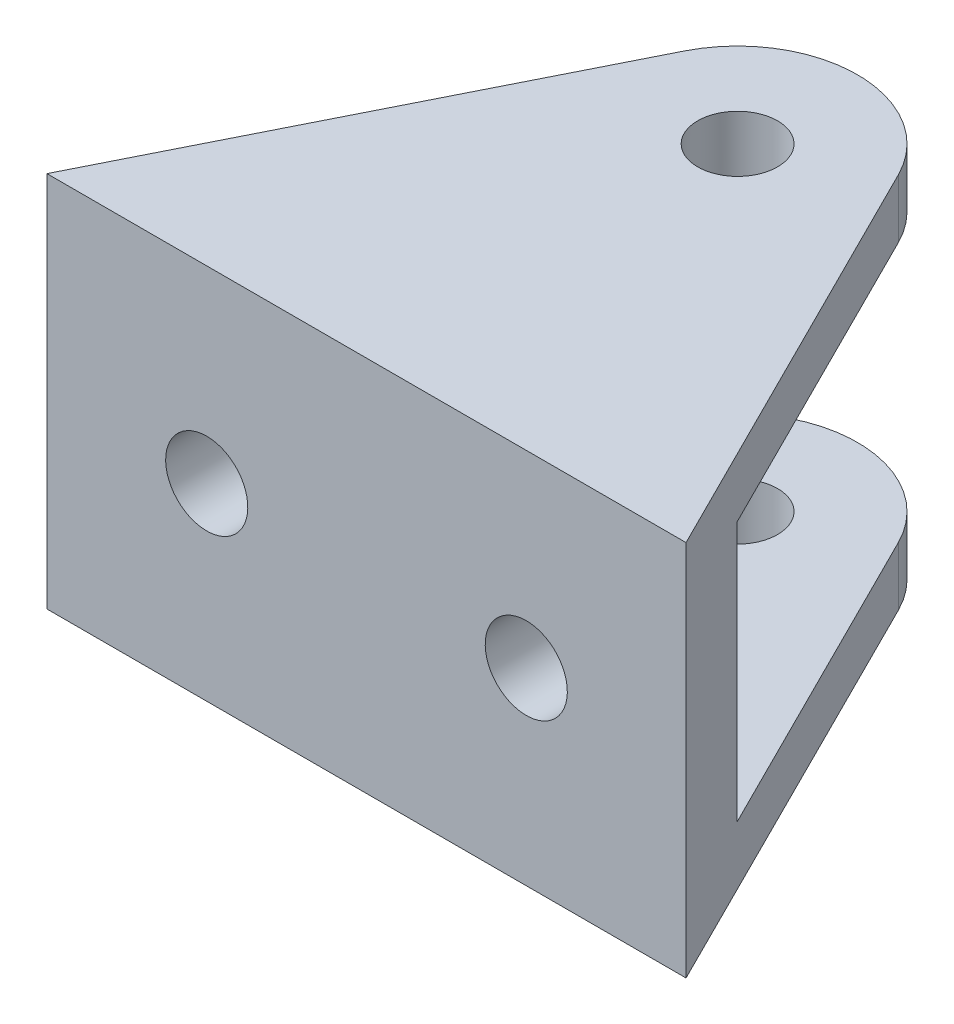
ISO-10303-21;
HEADER;
FILE_DESCRIPTION(('STEP AP214'),'2;1');
FILE_NAME('part.step','',(''),(''),'','','');
FILE_SCHEMA(('AUTOMOTIVE_DESIGN { 1 0 10303 214 1 1 1 1 }'));
ENDSEC;
DATA;
#1=APPLICATION_CONTEXT('core data for automotive mechanical design processes');
#2=APPLICATION_PROTOCOL_DEFINITION('international standard','automotive_design',2000,#1);
#3=PRODUCT_CONTEXT('',#1,'mechanical');
#4=PRODUCT('Part','Part','',(#3));
#5=PRODUCT_RELATED_PRODUCT_CATEGORY('part','',(#4));
#6=PRODUCT_DEFINITION_FORMATION('','',#4);
#7=PRODUCT_DEFINITION_CONTEXT('part definition',#1,'design');
#8=PRODUCT_DEFINITION('design','',#6,#7);
#9=PRODUCT_DEFINITION_SHAPE('','',#8);
#10=(LENGTH_UNIT() NAMED_UNIT(*) SI_UNIT(.MILLI.,.METRE.));
#11=(NAMED_UNIT(*) PLANE_ANGLE_UNIT() SI_UNIT($,.RADIAN.));
#12=(NAMED_UNIT(*) SI_UNIT($,.STERADIAN.) SOLID_ANGLE_UNIT());
#13=UNCERTAINTY_MEASURE_WITH_UNIT(LENGTH_MEASURE(1.E-05),#10,'distance_accuracy_value','');
#14=(GEOMETRIC_REPRESENTATION_CONTEXT(3) GLOBAL_UNCERTAINTY_ASSIGNED_CONTEXT((#13)) GLOBAL_UNIT_ASSIGNED_CONTEXT((#10,
#11,#12)) REPRESENTATION_CONTEXT('',''));
#15=CARTESIAN_POINT('',(0.,0.,0.));
#16=DIRECTION('',(0.,0.,1.));
#17=DIRECTION('',(1.,0.,0.));
#18=AXIS2_PLACEMENT_3D('',#15,#16,#17);
#19=CARTESIAN_POINT('',(50.8,0.,-39.8563150306832));
#20=DIRECTION('',(0.,1.,0.));
#21=DIRECTION('',(0.,0.,1.));
#22=AXIS2_PLACEMENT_3D('',#19,#20,#21);
#23=PLANE('',#22);
#24=CARTESIAN_POINT('',(25.4,0.,-29.4977893685772));
#25=DIRECTION('',(0.,-1.,0.));
#26=DIRECTION('',(0.,0.,-1.));
#27=AXIS2_PLACEMENT_3D('',#24,#25,#26);
#28=CIRCLE('',#27,3.175);
#29=CARTESIAN_POINT('',(25.4,0.,-32.6727893685772));
#30=VERTEX_POINT('',#29);
#31=EDGE_CURVE('E216',#30,#30,#28,.T.);
#32=ORIENTED_EDGE('',*,*,#31,.F.);
#33=EDGE_LOOP('',(#32));
#34=FACE_BOUND('',#33,.T.);
#35=DIRECTION('',(-1.,0.,0.));
#36=VECTOR('',#35,1.);
#37=CARTESIAN_POINT('',(50.8,0.,0.));
#38=LINE('',#37,#36);
#39=CARTESIAN_POINT('',(50.8,0.,0.));
#40=VERTEX_POINT('',#39);
#41=CARTESIAN_POINT('',(0.,0.,0.));
#42=VERTEX_POINT('',#41);
#43=EDGE_CURVE('E135',#40,#42,#38,.T.);
#44=ORIENTED_EDGE('',*,*,#43,.T.);
#45=DIRECTION('',(-0.44725241700816,0.,0.894407779192668));
#46=VECTOR('',#45,1.);
#47=CARTESIAN_POINT('',(0.,0.,0.));
#48=LINE('',#47,#46);
#49=CARTESIAN_POINT('',(16.8807659031898,0.,-33.7578686405799));
#50=VERTEX_POINT('',#49);
#51=EDGE_CURVE('E70',#50,#42,#48,.T.);
#52=ORIENTED_EDGE('',*,*,#51,.F.);
#53=CARTESIAN_POINT('',(25.4,0.,-29.4977893685772));
#54=DIRECTION('',(0.,1.,0.));
#55=DIRECTION('',(0.,0.,-1.));
#56=AXIS2_PLACEMENT_3D('',#53,#54,#55);
#57=CIRCLE('',#56,9.525);
#58=CARTESIAN_POINT('',(33.9192340968102,0.,-33.7578686405799));
#59=VERTEX_POINT('',#58);
#60=EDGE_CURVE('E230',#59,#50,#57,.T.);
#61=ORIENTED_EDGE('',*,*,#60,.F.);
#62=DIRECTION('',(-0.447252417008159,0.,-0.894407779192668));
#63=VECTOR('',#62,1.);
#64=CARTESIAN_POINT('',(50.8,0.,0.));
#65=LINE('',#64,#63);
#66=EDGE_CURVE('E220',#40,#59,#65,.T.);
#67=ORIENTED_EDGE('',*,*,#66,.F.);
#68=EDGE_LOOP('',(#44,#52,#61,#67));
#69=FACE_BOUND('',#68,.T.);
#70=ADVANCED_FACE('F47',(#34,#69),#23,.F.);
#71=CARTESIAN_POINT('',(50.8,4.6609,-8.10631503068315));
#72=DIRECTION('',(0.,-1.,0.));
#73=DIRECTION('',(0.,0.,-1.));
#74=AXIS2_PLACEMENT_3D('',#71,#72,#73);
#75=PLANE('',#74);
#76=CARTESIAN_POINT('',(25.4,4.6609,-29.4977893685772));
#77=DIRECTION('',(0.,-1.,0.));
#78=DIRECTION('',(0.,0.,-1.));
#79=AXIS2_PLACEMENT_3D('',#76,#77,#78);
#80=CIRCLE('',#79,3.175);
#81=CARTESIAN_POINT('',(25.4,4.6609,-32.6727893685772));
#82=VERTEX_POINT('',#81);
#83=EDGE_CURVE('E183',#82,#82,#80,.T.);
#84=ORIENTED_EDGE('',*,*,#83,.T.);
#85=EDGE_LOOP('',(#84));
#86=FACE_BOUND('',#85,.T.);
#87=CARTESIAN_POINT('',(25.4,4.6609,-29.4977893685772));
#88=DIRECTION('',(0.,-1.,0.));
#89=DIRECTION('',(0.,0.,-1.));
#90=AXIS2_PLACEMENT_3D('',#87,#88,#89);
#91=CIRCLE('',#90,9.525);
#92=CARTESIAN_POINT('',(33.9192340968102,4.6609,-33.7578686405799));
#93=VERTEX_POINT('',#92);
#94=CARTESIAN_POINT('',(16.8807659031898,4.6609,-33.7578686405799));
#95=VERTEX_POINT('',#94);
#96=EDGE_CURVE('E175',#93,#95,#91,.F.);
#97=ORIENTED_EDGE('',*,*,#96,.T.);
#98=DIRECTION('',(-0.44725241700816,0.,0.894407779192667));
#99=VECTOR('',#98,1.);
#100=CARTESIAN_POINT('',(13.404501114703,4.6609,-26.8060934212199));
#101=LINE('',#100,#99);
#102=CARTESIAN_POINT('',(4.05359733540691,4.66090000000001,-8.10631503068315));
#103=VERTEX_POINT('',#102);
#104=EDGE_CURVE('E200',#95,#103,#101,.T.);
#105=ORIENTED_EDGE('',*,*,#104,.T.);
#106=DIRECTION('',(-1.,0.,0.));
#107=VECTOR('',#106,1.);
#108=CARTESIAN_POINT('',(50.8,4.6609,-8.10631503068315));
#109=LINE('',#108,#107);
#110=CARTESIAN_POINT('',(46.7464026645931,4.6609,-8.10631503068315));
#111=VERTEX_POINT('',#110);
#112=EDGE_CURVE('E11',#111,#103,#109,.T.);
#113=ORIENTED_EDGE('',*,*,#112,.F.);
#114=DIRECTION('',(-0.447252417008159,0.,-0.894407779192668));
#115=VECTOR('',#114,1.);
#116=CARTESIAN_POINT('',(47.5572628908948,4.6609,-6.48477053665103));
#117=LINE('',#116,#115);
#118=EDGE_CURVE('E191',#111,#93,#117,.T.);
#119=ORIENTED_EDGE('',*,*,#118,.T.);
#120=EDGE_LOOP('',(#97,#105,#113,#119));
#121=FACE_BOUND('',#120,.T.);
#122=ADVANCED_FACE('F255',(#86,#121),#75,.F.);
#123=CARTESIAN_POINT('',(50.8,25.3111,-8.10631503068315));
#124=DIRECTION('',(0.,0.,1.));
#125=DIRECTION('',(0.,-1.,0.));
#126=AXIS2_PLACEMENT_3D('',#123,#124,#125);
#127=PLANE('',#126);
#128=CARTESIAN_POINT('',(38.1,14.986,-8.10631503068315));
#129=DIRECTION('',(0.,0.,-1.));
#130=DIRECTION('',(0.,1.,0.));
#131=AXIS2_PLACEMENT_3D('',#128,#129,#130);
#132=CIRCLE('',#131,7.14374999999999);
#133=CARTESIAN_POINT('',(38.1,22.12975,-8.10631503068315));
#134=VERTEX_POINT('',#133);
#135=EDGE_CURVE('E171',#134,#134,#132,.T.);
#136=ORIENTED_EDGE('',*,*,#135,.F.);
#137=EDGE_LOOP('',(#136));
#138=FACE_BOUND('',#137,.T.);
#139=CARTESIAN_POINT('',(12.7,14.986,-8.10631503068315));
#140=DIRECTION('',(0.,0.,-1.));
#141=DIRECTION('',(0.,1.,0.));
#142=AXIS2_PLACEMENT_3D('',#139,#140,#141);
#143=CIRCLE('',#142,7.14374999999999);
#144=CARTESIAN_POINT('',(12.7,22.12975,-8.10631503068315));
#145=VERTEX_POINT('',#144);
#146=EDGE_CURVE('E155',#145,#145,#143,.T.);
#147=ORIENTED_EDGE('',*,*,#146,.F.);
#148=EDGE_LOOP('',(#147));
#149=FACE_BOUND('',#148,.T.);
#150=ORIENTED_EDGE('',*,*,#112,.T.);
#151=DIRECTION('',(0.,1.,0.));
#152=VECTOR('',#151,1.);
#153=CARTESIAN_POINT('',(4.05359733540691,25.3111,-8.10631503068315));
#154=LINE('',#153,#152);
#155=CARTESIAN_POINT('',(4.05359733540691,25.3111,-8.10631503068315));
#156=VERTEX_POINT('',#155);
#157=EDGE_CURVE('E204',#103,#156,#154,.T.);
#158=ORIENTED_EDGE('',*,*,#157,.T.);
#159=DIRECTION('',(-1.,0.,0.));
#160=VECTOR('',#159,1.);
#161=CARTESIAN_POINT('',(50.8,25.3111,-8.10631503068315));
#162=LINE('',#161,#160);
#163=CARTESIAN_POINT('',(46.7464026645931,25.3111,-8.10631503068315));
#164=VERTEX_POINT('',#163);
#165=EDGE_CURVE('E55',#164,#156,#162,.T.);
#166=ORIENTED_EDGE('',*,*,#165,.F.);
#167=DIRECTION('',(0.,-1.,0.));
#168=VECTOR('',#167,1.);
#169=CARTESIAN_POINT('',(46.7464026645931,25.3111,-8.10631503068315));
#170=LINE('',#169,#168);
#171=EDGE_CURVE('E62',#164,#111,#170,.T.);
#172=ORIENTED_EDGE('',*,*,#171,.T.);
#173=EDGE_LOOP('',(#150,#158,#166,#172));
#174=FACE_BOUND('',#173,.T.);
#175=ADVANCED_FACE('F261',(#138,#149,#174),#127,.F.);
#176=CARTESIAN_POINT('',(50.8,25.3111,-39.8563150306832));
#177=DIRECTION('',(0.,1.,0.));
#178=DIRECTION('',(0.,0.,1.));
#179=AXIS2_PLACEMENT_3D('',#176,#177,#178);
#180=PLANE('',#179);
#181=CARTESIAN_POINT('',(25.4,25.3111,-29.4977893685772));
#182=DIRECTION('',(0.,1.,0.));
#183=DIRECTION('',(0.,0.,1.));
#184=AXIS2_PLACEMENT_3D('',#181,#182,#183);
#185=CIRCLE('',#184,3.175);
#186=CARTESIAN_POINT('',(25.4,25.3111,-26.3227893685772));
#187=VERTEX_POINT('',#186);
#188=EDGE_CURVE('E187',#187,#187,#185,.T.);
#189=ORIENTED_EDGE('',*,*,#188,.T.);
#190=EDGE_LOOP('',(#189));
#191=FACE_BOUND('',#190,.T.);
#192=ORIENTED_EDGE('',*,*,#165,.T.);
#193=DIRECTION('',(0.44725241700816,0.,-0.894407779192667));
#194=VECTOR('',#193,1.);
#195=CARTESIAN_POINT('',(26.1053279175585,25.3111,-52.2049909177213));
#196=LINE('',#195,#194);
#197=CARTESIAN_POINT('',(16.8807659031898,25.3111,-33.7578686405799));
#198=VERTEX_POINT('',#197);
#199=EDGE_CURVE('E208',#156,#198,#196,.T.);
#200=ORIENTED_EDGE('',*,*,#199,.T.);
#201=CARTESIAN_POINT('',(25.4,25.3111,-29.4977893685772));
#202=DIRECTION('',(0.,1.,0.));
#203=DIRECTION('',(0.,0.,1.));
#204=AXIS2_PLACEMENT_3D('',#201,#202,#203);
#205=CIRCLE('',#204,9.525);
#206=CARTESIAN_POINT('',(33.9192340968102,25.3111,-33.7578686405799));
#207=VERTEX_POINT('',#206);
#208=EDGE_CURVE('E179',#198,#207,#205,.F.);
#209=ORIENTED_EDGE('',*,*,#208,.T.);
#210=DIRECTION('',(0.447252417008159,0.,0.894407779192668));
#211=VECTOR('',#210,1.);
#212=CARTESIAN_POINT('',(34.8564360880392,25.3111,-31.8836680331524));
#213=LINE('',#212,#211);
#214=EDGE_CURVE('E197',#207,#164,#213,.T.);
#215=ORIENTED_EDGE('',*,*,#214,.T.);
#216=EDGE_LOOP('',(#192,#200,#209,#215));
#217=FACE_BOUND('',#216,.T.);
#218=ADVANCED_FACE('F276',(#191,#217),#180,.F.);
#219=CARTESIAN_POINT('',(50.8,29.972,0.));
#220=DIRECTION('',(0.,-1.,0.));
#221=DIRECTION('',(0.,0.,-1.));
#222=AXIS2_PLACEMENT_3D('',#219,#220,#221);
#223=PLANE('',#222);
#224=CARTESIAN_POINT('',(25.4,29.972,-29.4977893685772));
#225=DIRECTION('',(0.,-1.,0.));
#226=DIRECTION('',(0.,0.,-1.));
#227=AXIS2_PLACEMENT_3D('',#224,#225,#226);
#228=CIRCLE('',#227,3.175);
#229=CARTESIAN_POINT('',(25.4,29.972,-32.6727893685772));
#230=VERTEX_POINT('',#229);
#231=EDGE_CURVE('E212',#230,#230,#228,.F.);
#232=ORIENTED_EDGE('',*,*,#231,.F.);
#233=EDGE_LOOP('',(#232));
#234=FACE_BOUND('',#233,.T.);
#235=CARTESIAN_POINT('',(25.4,29.972,-29.4977893685772));
#236=DIRECTION('',(0.,-1.,0.));
#237=DIRECTION('',(0.,0.,-1.));
#238=AXIS2_PLACEMENT_3D('',#235,#236,#237);
#239=CIRCLE('',#238,9.525);
#240=CARTESIAN_POINT('',(16.8807659031898,29.972,-33.7578686405799));
#241=VERTEX_POINT('',#240);
#242=CARTESIAN_POINT('',(33.9192340968102,29.972,-33.7578686405799));
#243=VERTEX_POINT('',#242);
#244=EDGE_CURVE('E130',#241,#243,#239,.T.);
#245=ORIENTED_EDGE('',*,*,#244,.F.);
#246=DIRECTION('',(0.44725241700816,0.,-0.894407779192667));
#247=VECTOR('',#246,1.);
#248=CARTESIAN_POINT('',(0.,29.972,0.));
#249=LINE('',#248,#247);
#250=CARTESIAN_POINT('',(0.,29.972,0.));
#251=VERTEX_POINT('',#250);
#252=EDGE_CURVE('E113',#251,#241,#249,.T.);
#253=ORIENTED_EDGE('',*,*,#252,.F.);
#254=DIRECTION('',(-1.,0.,0.));
#255=VECTOR('',#254,1.);
#256=CARTESIAN_POINT('',(50.8,29.972,0.));
#257=LINE('',#256,#255);
#258=CARTESIAN_POINT('',(50.8,29.972,0.));
#259=VERTEX_POINT('',#258);
#260=EDGE_CURVE('E128',#259,#251,#257,.T.);
#261=ORIENTED_EDGE('',*,*,#260,.F.);
#262=DIRECTION('',(0.447252417008159,0.,0.894407779192668));
#263=VECTOR('',#262,1.);
#264=CARTESIAN_POINT('',(50.8,29.972,0.));
#265=LINE('',#264,#263);
#266=EDGE_CURVE('E221',#243,#259,#265,.T.);
#267=ORIENTED_EDGE('',*,*,#266,.F.);
#268=EDGE_LOOP('',(#245,#253,#261,#267));
#269=FACE_BOUND('',#268,.T.);
#270=ADVANCED_FACE('F126',(#234,#269),#223,.F.);
#271=CARTESIAN_POINT('',(50.8,0.,0.));
#272=DIRECTION('',(0.,0.,-1.));
#273=DIRECTION('',(-1.,0.,0.));
#274=AXIS2_PLACEMENT_3D('',#271,#272,#273);
#275=PLANE('',#274);
#276=CARTESIAN_POINT('',(38.1,14.986,0.));
#277=DIRECTION('',(0.,0.,-1.));
#278=DIRECTION('',(0.,1.,0.));
#279=AXIS2_PLACEMENT_3D('',#276,#277,#278);
#280=CIRCLE('',#279,3.2639);
#281=CARTESIAN_POINT('',(38.1,18.2499,0.));
#282=VERTEX_POINT('',#281);
#283=EDGE_CURVE('E159',#282,#282,#280,.T.);
#284=ORIENTED_EDGE('',*,*,#283,.T.);
#285=EDGE_LOOP('',(#284));
#286=FACE_BOUND('',#285,.T.);
#287=CARTESIAN_POINT('',(12.7,14.986,0.));
#288=DIRECTION('',(0.,0.,-1.));
#289=DIRECTION('',(0.,1.,0.));
#290=AXIS2_PLACEMENT_3D('',#287,#288,#289);
#291=CIRCLE('',#290,3.2639);
#292=CARTESIAN_POINT('',(12.7,18.2499,0.));
#293=VERTEX_POINT('',#292);
#294=EDGE_CURVE('E121',#293,#293,#291,.T.);
#295=ORIENTED_EDGE('',*,*,#294,.T.);
#296=EDGE_LOOP('',(#295));
#297=FACE_BOUND('',#296,.T.);
#298=DIRECTION('',(0.,-1.,0.));
#299=VECTOR('',#298,1.);
#300=CARTESIAN_POINT('',(0.,0.,0.));
#301=LINE('',#300,#299);
#302=EDGE_CURVE('E109',#251,#42,#301,.T.);
#303=ORIENTED_EDGE('',*,*,#302,.T.);
#304=ORIENTED_EDGE('',*,*,#43,.F.);
#305=DIRECTION('',(0.,-1.,0.));
#306=VECTOR('',#305,1.);
#307=CARTESIAN_POINT('',(50.8,0.,0.));
#308=LINE('',#307,#306);
#309=EDGE_CURVE('E120',#259,#40,#308,.T.);
#310=ORIENTED_EDGE('',*,*,#309,.F.);
#311=ORIENTED_EDGE('',*,*,#260,.T.);
#312=EDGE_LOOP('',(#303,#304,#310,#311));
#313=FACE_BOUND('',#312,.T.);
#314=ADVANCED_FACE('F133',(#286,#297,#313),#275,.F.);
#315=CARTESIAN_POINT('',(12.7,14.986,-8.10631503068315));
#316=DIRECTION('',(0.,0.,-1.));
#317=DIRECTION('',(0.,1.,0.));
#318=AXIS2_PLACEMENT_3D('',#315,#316,#317);
#319=CYLINDRICAL_SURFACE('',#318,3.2639);
#320=ORIENTED_EDGE('',*,*,#294,.F.);
#321=EDGE_LOOP('',(#320));
#322=FACE_BOUND('',#321,.T.);
#323=CARTESIAN_POINT('',(12.7,14.986,-4.80431503068315));
#324=DIRECTION('',(0.,0.,-1.));
#325=DIRECTION('',(0.,1.,0.));
#326=AXIS2_PLACEMENT_3D('',#323,#324,#325);
#327=CIRCLE('',#326,3.26390000000001);
#328=CARTESIAN_POINT('',(12.7,18.2499,-4.80431503068315));
#329=VERTEX_POINT('',#328);
#330=EDGE_CURVE('E147',#329,#329,#327,.T.);
#331=ORIENTED_EDGE('',*,*,#330,.T.);
#332=EDGE_LOOP('',(#331));
#333=FACE_BOUND('',#332,.T.);
#334=ADVANCED_FACE('F307',(#322,#333),#319,.F.);
#335=CARTESIAN_POINT('',(15.9639,14.986,-4.80431503068315));
#336=DIRECTION('',(0.,0.,1.));
#337=DIRECTION('',(0.,-1.,0.));
#338=AXIS2_PLACEMENT_3D('',#335,#336,#337);
#339=PLANE('',#338);
#340=ORIENTED_EDGE('',*,*,#330,.F.);
#341=EDGE_LOOP('',(#340));
#342=FACE_BOUND('',#341,.T.);
#343=CARTESIAN_POINT('',(12.7,14.986,-4.80431503068315));
#344=DIRECTION('',(0.,0.,-1.));
#345=DIRECTION('',(0.,1.,0.));
#346=AXIS2_PLACEMENT_3D('',#343,#344,#345);
#347=CIRCLE('',#346,7.14374999999999);
#348=CARTESIAN_POINT('',(12.7,22.12975,-4.80431503068315));
#349=VERTEX_POINT('',#348);
#350=EDGE_CURVE('E151',#349,#349,#347,.T.);
#351=ORIENTED_EDGE('',*,*,#350,.T.);
#352=EDGE_LOOP('',(#351));
#353=FACE_BOUND('',#352,.T.);
#354=ADVANCED_FACE('F303',(#342,#353),#339,.F.);
#355=CARTESIAN_POINT('',(12.7,14.986,-8.10631503068315));
#356=DIRECTION('',(0.,0.,-1.));
#357=DIRECTION('',(0.,1.,0.));
#358=AXIS2_PLACEMENT_3D('',#355,#356,#357);
#359=CYLINDRICAL_SURFACE('',#358,7.14374999999999);
#360=ORIENTED_EDGE('',*,*,#350,.F.);
#361=EDGE_LOOP('',(#360));
#362=FACE_BOUND('',#361,.T.);
#363=ORIENTED_EDGE('',*,*,#146,.T.);
#364=EDGE_LOOP('',(#363));
#365=FACE_BOUND('',#364,.T.);
#366=ADVANCED_FACE('F299',(#362,#365),#359,.F.);
#367=CARTESIAN_POINT('',(38.1,14.986,-8.10631503068315));
#368=DIRECTION('',(0.,0.,-1.));
#369=DIRECTION('',(0.,1.,0.));
#370=AXIS2_PLACEMENT_3D('',#367,#368,#369);
#371=CYLINDRICAL_SURFACE('',#370,3.26390000000001);
#372=ORIENTED_EDGE('',*,*,#283,.F.);
#373=EDGE_LOOP('',(#372));
#374=FACE_BOUND('',#373,.T.);
#375=CARTESIAN_POINT('',(38.1,14.986,-4.80431503068315));
#376=DIRECTION('',(0.,0.,-1.));
#377=DIRECTION('',(0.,1.,0.));
#378=AXIS2_PLACEMENT_3D('',#375,#376,#377);
#379=CIRCLE('',#378,3.26390000000001);
#380=CARTESIAN_POINT('',(38.1,18.2499,-4.80431503068315));
#381=VERTEX_POINT('',#380);
#382=EDGE_CURVE('E163',#381,#381,#379,.T.);
#383=ORIENTED_EDGE('',*,*,#382,.T.);
#384=EDGE_LOOP('',(#383));
#385=FACE_BOUND('',#384,.T.);
#386=ADVANCED_FACE('F295',(#374,#385),#371,.F.);
#387=CARTESIAN_POINT('',(41.3639,14.986,-4.80431503068315));
#388=DIRECTION('',(0.,0.,1.));
#389=DIRECTION('',(0.,-1.,0.));
#390=AXIS2_PLACEMENT_3D('',#387,#388,#389);
#391=PLANE('',#390);
#392=ORIENTED_EDGE('',*,*,#382,.F.);
#393=EDGE_LOOP('',(#392));
#394=FACE_BOUND('',#393,.T.);
#395=CARTESIAN_POINT('',(38.1,14.986,-4.80431503068315));
#396=DIRECTION('',(0.,0.,-1.));
#397=DIRECTION('',(0.,1.,0.));
#398=AXIS2_PLACEMENT_3D('',#395,#396,#397);
#399=CIRCLE('',#398,7.14374999999999);
#400=CARTESIAN_POINT('',(38.1,22.12975,-4.80431503068315));
#401=VERTEX_POINT('',#400);
#402=EDGE_CURVE('E167',#401,#401,#399,.T.);
#403=ORIENTED_EDGE('',*,*,#402,.T.);
#404=EDGE_LOOP('',(#403));
#405=FACE_BOUND('',#404,.T.);
#406=ADVANCED_FACE('F291',(#394,#405),#391,.F.);
#407=CARTESIAN_POINT('',(38.1,14.986,-8.10631503068315));
#408=DIRECTION('',(0.,0.,-1.));
#409=DIRECTION('',(0.,1.,0.));
#410=AXIS2_PLACEMENT_3D('',#407,#408,#409);
#411=CYLINDRICAL_SURFACE('',#410,7.14374999999999);
#412=ORIENTED_EDGE('',*,*,#402,.F.);
#413=EDGE_LOOP('',(#412));
#414=FACE_BOUND('',#413,.T.);
#415=ORIENTED_EDGE('',*,*,#135,.T.);
#416=EDGE_LOOP('',(#415));
#417=FACE_BOUND('',#416,.T.);
#418=ADVANCED_FACE('F286',(#414,#417),#411,.F.);
#419=CARTESIAN_POINT('',(25.4,94.5410781088367,-29.4977893685772));
#420=DIRECTION('',(0.,-1.,0.));
#421=DIRECTION('',(0.,0.,-1.));
#422=AXIS2_PLACEMENT_3D('',#419,#420,#421);
#423=CYLINDRICAL_SURFACE('',#422,9.525);
#424=DIRECTION('',(0.,-1.,0.));
#425=VECTOR('',#424,1.);
#426=CARTESIAN_POINT('',(33.9192340968102,94.5410781088367,-33.7578686405799));
#427=LINE('',#426,#425);
#428=EDGE_CURVE('E240',#93,#59,#427,.T.);
#429=ORIENTED_EDGE('',*,*,#428,.T.);
#430=ORIENTED_EDGE('',*,*,#60,.T.);
#431=DIRECTION('',(0.,-1.,0.));
#432=VECTOR('',#431,1.);
#433=CARTESIAN_POINT('',(16.8807659031898,94.5410781088367,-33.7578686405799));
#434=LINE('',#433,#432);
#435=EDGE_CURVE('E224',#95,#50,#434,.T.);
#436=ORIENTED_EDGE('',*,*,#435,.F.);
#437=ORIENTED_EDGE('',*,*,#96,.F.);
#438=EDGE_LOOP('',(#429,#430,#436,#437));
#439=FACE_BOUND('',#438,.T.);
#440=ADVANCED_FACE('F248',(#439),#423,.T.);
#441=EDGE_CURVE('E237',#241,#198,#434,.T.);
#442=ORIENTED_EDGE('',*,*,#441,.F.);
#443=ORIENTED_EDGE('',*,*,#244,.T.);
#444=EDGE_CURVE('E236',#243,#207,#427,.T.);
#445=ORIENTED_EDGE('',*,*,#444,.T.);
#446=ORIENTED_EDGE('',*,*,#208,.F.);
#447=EDGE_LOOP('',(#442,#443,#445,#446));
#448=FACE_BOUND('',#447,.T.);
#449=ADVANCED_FACE('F277',(#448),#423,.T.);
#450=CARTESIAN_POINT('',(50.8,94.5410781088367,0.));
#451=DIRECTION('',(-0.894407779192667,0.,0.447252417008159));
#452=DIRECTION('',(0.447252417008159,0.,0.894407779192668));
#453=AXIS2_PLACEMENT_3D('',#450,#451,#452);
#454=PLANE('',#453);
#455=ORIENTED_EDGE('',*,*,#171,.F.);
#456=ORIENTED_EDGE('',*,*,#214,.F.);
#457=ORIENTED_EDGE('',*,*,#444,.F.);
#458=ORIENTED_EDGE('',*,*,#266,.T.);
#459=ORIENTED_EDGE('',*,*,#309,.T.);
#460=ORIENTED_EDGE('',*,*,#66,.T.);
#461=ORIENTED_EDGE('',*,*,#428,.F.);
#462=ORIENTED_EDGE('',*,*,#118,.F.);
#463=EDGE_LOOP('',(#455,#456,#457,#458,#459,#460,#461,#462));
#464=FACE_BOUND('',#463,.T.);
#465=ADVANCED_FACE('F252',(#464),#454,.F.);
#466=CARTESIAN_POINT('',(0.,94.5410781088367,0.));
#467=DIRECTION('',(0.894407779192667,0.,0.44725241700816));
#468=DIRECTION('',(0.44725241700816,0.,-0.894407779192667));
#469=AXIS2_PLACEMENT_3D('',#466,#467,#468);
#470=PLANE('',#469);
#471=ORIENTED_EDGE('',*,*,#435,.T.);
#472=ORIENTED_EDGE('',*,*,#51,.T.);
#473=ORIENTED_EDGE('',*,*,#302,.F.);
#474=ORIENTED_EDGE('',*,*,#252,.T.);
#475=ORIENTED_EDGE('',*,*,#441,.T.);
#476=ORIENTED_EDGE('',*,*,#199,.F.);
#477=ORIENTED_EDGE('',*,*,#157,.F.);
#478=ORIENTED_EDGE('',*,*,#104,.F.);
#479=EDGE_LOOP('',(#471,#472,#473,#474,#475,#476,#477,#478));
#480=FACE_BOUND('',#479,.T.);
#481=ADVANCED_FACE('F111',(#480),#470,.F.);
#482=CARTESIAN_POINT('',(25.4,94.5410781088367,-29.4977893685772));
#483=DIRECTION('',(0.,-1.,0.));
#484=DIRECTION('',(0.,0.,-1.));
#485=AXIS2_PLACEMENT_3D('',#482,#483,#484);
#486=CYLINDRICAL_SURFACE('',#485,3.175);
#487=ORIENTED_EDGE('',*,*,#231,.T.);
#488=EDGE_LOOP('',(#487));
#489=FACE_BOUND('',#488,.T.);
#490=ORIENTED_EDGE('',*,*,#188,.F.);
#491=EDGE_LOOP('',(#490));
#492=FACE_BOUND('',#491,.T.);
#493=ADVANCED_FACE('F268',(#489,#492),#486,.F.);
#494=ORIENTED_EDGE('',*,*,#31,.T.);
#495=EDGE_LOOP('',(#494));
#496=FACE_BOUND('',#495,.T.);
#497=ORIENTED_EDGE('',*,*,#83,.F.);
#498=EDGE_LOOP('',(#497));
#499=FACE_BOUND('',#498,.T.);
#500=ADVANCED_FACE('F265',(#496,#499),#486,.F.);
#501=CLOSED_SHELL('',(#70,#122,#175,#218,#270,#314,#334,#354,#366,#386,#406,#418,#440,#449,#465,
#481,#493,#500));
#502=MANIFOLD_SOLID_BREP('B2',#501);
#503=ADVANCED_BREP_SHAPE_REPRESENTATION('',(#18,#502),#14);
#504=SHAPE_DEFINITION_REPRESENTATION(#9,#503);
ENDSEC;
END-ISO-10303-21;
